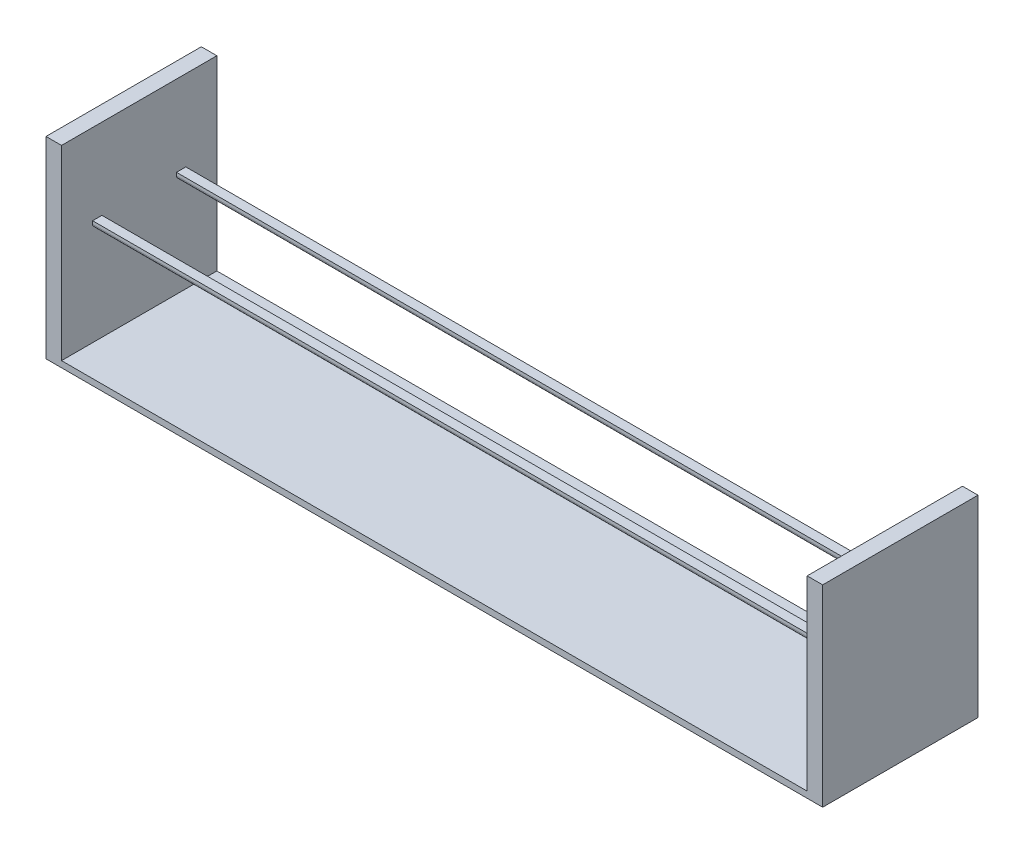
ISO-10303-21;
HEADER;
FILE_DESCRIPTION(('STEP AP214'),'2;1');
FILE_NAME('part.step','',(''),(''),'','','');
FILE_SCHEMA(('AUTOMOTIVE_DESIGN { 1 0 10303 214 1 1 1 1 }'));
ENDSEC;
DATA;
#1=APPLICATION_CONTEXT('core data for automotive mechanical design processes');
#2=APPLICATION_PROTOCOL_DEFINITION('international standard','automotive_design',2000,#1);
#3=PRODUCT_CONTEXT('',#1,'mechanical');
#4=PRODUCT('Part','Part','',(#3));
#5=PRODUCT_RELATED_PRODUCT_CATEGORY('part','',(#4));
#6=PRODUCT_DEFINITION_FORMATION('','',#4);
#7=PRODUCT_DEFINITION_CONTEXT('part definition',#1,'design');
#8=PRODUCT_DEFINITION('design','',#6,#7);
#9=PRODUCT_DEFINITION_SHAPE('','',#8);
#10=(LENGTH_UNIT() NAMED_UNIT(*) SI_UNIT(.MILLI.,.METRE.));
#11=(NAMED_UNIT(*) PLANE_ANGLE_UNIT() SI_UNIT($,.RADIAN.));
#12=(NAMED_UNIT(*) SI_UNIT($,.STERADIAN.) SOLID_ANGLE_UNIT());
#13=UNCERTAINTY_MEASURE_WITH_UNIT(LENGTH_MEASURE(1.E-05),#10,'distance_accuracy_value','');
#14=(GEOMETRIC_REPRESENTATION_CONTEXT(3) GLOBAL_UNCERTAINTY_ASSIGNED_CONTEXT((#13)) GLOBAL_UNIT_ASSIGNED_CONTEXT((#10,
#11,#12)) REPRESENTATION_CONTEXT('',''));
#15=CARTESIAN_POINT('',(0.,0.,0.));
#16=DIRECTION('',(0.,0.,1.));
#17=DIRECTION('',(1.,0.,0.));
#18=AXIS2_PLACEMENT_3D('',#15,#16,#17);
#19=CARTESIAN_POINT('',(-53.4366771151389,310.,-22.1468264795686));
#20=DIRECTION('',(-1.,0.,0.));
#21=DIRECTION('',(0.,0.,1.));
#22=AXIS2_PLACEMENT_3D('',#19,#20,#21);
#23=PLANE('',#22);
#24=DIRECTION('',(0.,0.,1.));
#25=VECTOR('',#24,1.);
#26=CARTESIAN_POINT('',(-53.4366771151389,180.,27.8531735204314));
#27=LINE('',#26,#25);
#28=CARTESIAN_POINT('',(-53.4366771151389,180.,27.8531735204314));
#29=VERTEX_POINT('',#28);
#30=CARTESIAN_POINT('',(-53.4366771151389,180.,42.8531735204314));
#31=VERTEX_POINT('',#30);
#32=EDGE_CURVE('E192',#29,#31,#27,.T.);
#33=ORIENTED_EDGE('',*,*,#32,.F.);
#34=DIRECTION('',(0.,1.,0.));
#35=VECTOR('',#34,1.);
#36=CARTESIAN_POINT('',(-53.4366771151389,180.,27.8531735204314));
#37=LINE('',#36,#35);
#38=CARTESIAN_POINT('',(-53.4366771151389,175.,27.8531735204314));
#39=VERTEX_POINT('',#38);
#40=EDGE_CURVE('E235',#39,#29,#37,.T.);
#41=ORIENTED_EDGE('',*,*,#40,.F.);
#42=CARTESIAN_POINT('',(-53.4366771151389,175.,32.8531735204314));
#43=DIRECTION('',(-1.,0.,0.));
#44=DIRECTION('',(0.,0.,1.));
#45=AXIS2_PLACEMENT_3D('',#42,#43,#44);
#46=CIRCLE('',#45,5.);
#47=CARTESIAN_POINT('',(-53.4366771151389,170.,32.8531735204314));
#48=VERTEX_POINT('',#47);
#49=EDGE_CURVE('E390',#39,#48,#46,.T.);
#50=ORIENTED_EDGE('',*,*,#49,.T.);
#51=DIRECTION('',(0.,0.,-1.));
#52=VECTOR('',#51,1.);
#53=CARTESIAN_POINT('',(-53.4366771151389,170.,27.8531735204314));
#54=LINE('',#53,#52);
#55=CARTESIAN_POINT('',(-53.4366771151389,170.,37.8531735204314));
#56=VERTEX_POINT('',#55);
#57=EDGE_CURVE('E252',#56,#48,#54,.T.);
#58=ORIENTED_EDGE('',*,*,#57,.F.);
#59=CARTESIAN_POINT('',(-53.4366771151389,175.,37.8531735204314));
#60=DIRECTION('',(-1.,0.,0.));
#61=DIRECTION('',(0.,0.,1.));
#62=AXIS2_PLACEMENT_3D('',#59,#60,#61);
#63=CIRCLE('',#62,5.);
#64=CARTESIAN_POINT('',(-53.4366771151389,175.,42.8531735204314));
#65=VERTEX_POINT('',#64);
#66=EDGE_CURVE('E53',#56,#65,#63,.T.);
#67=ORIENTED_EDGE('',*,*,#66,.T.);
#68=DIRECTION('',(0.,-1.,0.));
#69=VECTOR('',#68,1.);
#70=CARTESIAN_POINT('',(-53.4366771151389,180.,42.8531735204314));
#71=LINE('',#70,#69);
#72=EDGE_CURVE('E249',#31,#65,#71,.T.);
#73=ORIENTED_EDGE('',*,*,#72,.F.);
#74=EDGE_LOOP('',(#33,#41,#50,#58,#67,#73));
#75=FACE_BOUND('',#74,.T.);
#76=DIRECTION('',(0.,0.,-1.));
#77=VECTOR('',#76,1.);
#78=CARTESIAN_POINT('',(-53.4366771151389,10.,-22.1468264795686));
#79=LINE('',#78,#77);
#80=CARTESIAN_POINT('',(-53.4366771151389,10.,227.853173520431));
#81=VERTEX_POINT('',#80);
#82=CARTESIAN_POINT('',(-53.4366771151389,10.,-22.1468264795686));
#83=VERTEX_POINT('',#82);
#84=EDGE_CURVE('E278',#81,#83,#79,.T.);
#85=ORIENTED_EDGE('',*,*,#84,.T.);
#86=DIRECTION('',(0.,-1.,0.));
#87=VECTOR('',#86,1.);
#88=CARTESIAN_POINT('',(-53.4366771151389,310.,-22.1468264795686));
#89=LINE('',#88,#87);
#90=CARTESIAN_POINT('',(-53.4366771151389,310.,-22.1468264795686));
#91=VERTEX_POINT('',#90);
#92=EDGE_CURVE('E306',#91,#83,#89,.T.);
#93=ORIENTED_EDGE('',*,*,#92,.F.);
#94=DIRECTION('',(0.,0.,-1.));
#95=VECTOR('',#94,1.);
#96=CARTESIAN_POINT('',(-53.4366771151389,310.,-22.1468264795686));
#97=LINE('',#96,#95);
#98=CARTESIAN_POINT('',(-53.4366771151389,310.,227.853173520431));
#99=VERTEX_POINT('',#98);
#100=EDGE_CURVE('E299',#99,#91,#97,.T.);
#101=ORIENTED_EDGE('',*,*,#100,.F.);
#102=DIRECTION('',(0.,-1.,0.));
#103=VECTOR('',#102,1.);
#104=CARTESIAN_POINT('',(-53.4366771151389,310.,227.853173520431));
#105=LINE('',#104,#103);
#106=EDGE_CURVE('E313',#99,#81,#105,.T.);
#107=ORIENTED_EDGE('',*,*,#106,.T.);
#108=EDGE_LOOP('',(#85,#93,#101,#107));
#109=FACE_BOUND('',#108,.T.);
#110=DIRECTION('',(0.,-1.,0.));
#111=VECTOR('',#110,1.);
#112=CARTESIAN_POINT('',(-53.4366771151389,180.,177.853173520431));
#113=LINE('',#112,#111);
#114=CARTESIAN_POINT('',(-53.4366771151389,180.,177.853173520431));
#115=VERTEX_POINT('',#114);
#116=CARTESIAN_POINT('',(-53.4366771151389,175.,177.853173520431));
#117=VERTEX_POINT('',#116);
#118=EDGE_CURVE('E181',#115,#117,#113,.T.);
#119=ORIENTED_EDGE('',*,*,#118,.F.);
#120=DIRECTION('',(0.,0.,1.));
#121=VECTOR('',#120,1.);
#122=CARTESIAN_POINT('',(-53.4366771151389,180.,177.853173520431));
#123=LINE('',#122,#121);
#124=CARTESIAN_POINT('',(-53.4366771151389,180.,162.853173520431));
#125=VERTEX_POINT('',#124);
#126=EDGE_CURVE('E184',#125,#115,#123,.T.);
#127=ORIENTED_EDGE('',*,*,#126,.F.);
#128=DIRECTION('',(0.,1.,0.));
#129=VECTOR('',#128,1.);
#130=CARTESIAN_POINT('',(-53.4366771151389,180.,162.853173520431));
#131=LINE('',#130,#129);
#132=CARTESIAN_POINT('',(-53.4366771151389,175.,162.853173520431));
#133=VERTEX_POINT('',#132);
#134=EDGE_CURVE('E204',#133,#125,#131,.T.);
#135=ORIENTED_EDGE('',*,*,#134,.F.);
#136=CARTESIAN_POINT('',(-53.4366771151389,175.,167.853173520431));
#137=DIRECTION('',(-1.,0.,0.));
#138=DIRECTION('',(0.,0.,1.));
#139=AXIS2_PLACEMENT_3D('',#136,#137,#138);
#140=CIRCLE('',#139,5.);
#141=CARTESIAN_POINT('',(-53.4366771151389,170.,167.853173520431));
#142=VERTEX_POINT('',#141);
#143=EDGE_CURVE('E366',#133,#142,#140,.T.);
#144=ORIENTED_EDGE('',*,*,#143,.T.);
#145=DIRECTION('',(0.,0.,-1.));
#146=VECTOR('',#145,1.);
#147=CARTESIAN_POINT('',(-53.4366771151389,170.,177.853173520431));
#148=LINE('',#147,#146);
#149=CARTESIAN_POINT('',(-53.4366771151389,170.,172.853173520431));
#150=VERTEX_POINT('',#149);
#151=EDGE_CURVE('E193',#150,#142,#148,.T.);
#152=ORIENTED_EDGE('',*,*,#151,.F.);
#153=CARTESIAN_POINT('',(-53.4366771151389,175.,172.853173520431));
#154=DIRECTION('',(-1.,0.,0.));
#155=DIRECTION('',(0.,0.,1.));
#156=AXIS2_PLACEMENT_3D('',#153,#154,#155);
#157=CIRCLE('',#156,5.);
#158=EDGE_CURVE('E187',#150,#117,#157,.T.);
#159=ORIENTED_EDGE('',*,*,#158,.T.);
#160=EDGE_LOOP('',(#119,#127,#135,#144,#152,#159));
#161=FACE_BOUND('',#160,.T.);
#162=ADVANCED_FACE('F44',(#75,#109,#161),#23,.F.);
#163=CARTESIAN_POINT('',(1146.56332288486,310.,-22.1468264795686));
#164=DIRECTION('',(1.,0.,0.));
#165=DIRECTION('',(0.,0.,-1.));
#166=AXIS2_PLACEMENT_3D('',#163,#164,#165);
#167=PLANE('',#166);
#168=DIRECTION('',(0.,0.,1.));
#169=VECTOR('',#168,1.);
#170=CARTESIAN_POINT('',(1146.56332288486,180.,27.8531735204312));
#171=LINE('',#170,#169);
#172=CARTESIAN_POINT('',(1146.56332288486,180.,27.8531735204312));
#173=VERTEX_POINT('',#172);
#174=CARTESIAN_POINT('',(1146.56332288486,180.,42.8531735204312));
#175=VERTEX_POINT('',#174);
#176=EDGE_CURVE('E231',#173,#175,#171,.T.);
#177=ORIENTED_EDGE('',*,*,#176,.T.);
#178=DIRECTION('',(0.,-1.,0.));
#179=VECTOR('',#178,1.);
#180=CARTESIAN_POINT('',(1146.56332288486,180.,42.8531735204312));
#181=LINE('',#180,#179);
#182=CARTESIAN_POINT('',(1146.56332288486,175.,42.8531735204312));
#183=VERTEX_POINT('',#182);
#184=EDGE_CURVE('E234',#175,#183,#181,.T.);
#185=ORIENTED_EDGE('',*,*,#184,.T.);
#186=CARTESIAN_POINT('',(1146.56332288486,175.,37.8531735204312));
#187=DIRECTION('',(1.,0.,0.));
#188=DIRECTION('',(0.,0.,-1.));
#189=AXIS2_PLACEMENT_3D('',#186,#187,#188);
#190=CIRCLE('',#189,5.);
#191=CARTESIAN_POINT('',(1146.56332288486,170.,37.8531735204312));
#192=VERTEX_POINT('',#191);
#193=EDGE_CURVE('E11',#183,#192,#190,.T.);
#194=ORIENTED_EDGE('',*,*,#193,.T.);
#195=DIRECTION('',(0.,0.,-1.));
#196=VECTOR('',#195,1.);
#197=CARTESIAN_POINT('',(1146.56332288486,170.,27.8531735204312));
#198=LINE('',#197,#196);
#199=CARTESIAN_POINT('',(1146.56332288486,170.,32.8531735204312));
#200=VERTEX_POINT('',#199);
#201=EDGE_CURVE('E238',#192,#200,#198,.T.);
#202=ORIENTED_EDGE('',*,*,#201,.T.);
#203=CARTESIAN_POINT('',(1146.56332288486,175.,32.8531735204312));
#204=DIRECTION('',(1.,0.,0.));
#205=DIRECTION('',(0.,0.,-1.));
#206=AXIS2_PLACEMENT_3D('',#203,#204,#205);
#207=CIRCLE('',#206,5.);
#208=CARTESIAN_POINT('',(1146.56332288486,175.,27.8531735204312));
#209=VERTEX_POINT('',#208);
#210=EDGE_CURVE('E393',#200,#209,#207,.T.);
#211=ORIENTED_EDGE('',*,*,#210,.T.);
#212=DIRECTION('',(0.,1.,0.));
#213=VECTOR('',#212,1.);
#214=CARTESIAN_POINT('',(1146.56332288486,180.,27.8531735204312));
#215=LINE('',#214,#213);
#216=EDGE_CURVE('E242',#209,#173,#215,.T.);
#217=ORIENTED_EDGE('',*,*,#216,.T.);
#218=EDGE_LOOP('',(#177,#185,#194,#202,#211,#217));
#219=FACE_BOUND('',#218,.T.);
#220=DIRECTION('',(0.,0.,1.));
#221=VECTOR('',#220,1.);
#222=CARTESIAN_POINT('',(1146.56332288486,10.,-22.1468264795686));
#223=LINE('',#222,#221);
#224=CARTESIAN_POINT('',(1146.56332288486,10.,-22.1468264795686));
#225=VERTEX_POINT('',#224);
#226=CARTESIAN_POINT('',(1146.56332288486,10.,227.853173520431));
#227=VERTEX_POINT('',#226);
#228=EDGE_CURVE('E274',#225,#227,#223,.T.);
#229=ORIENTED_EDGE('',*,*,#228,.T.);
#230=DIRECTION('',(0.,-1.,0.));
#231=VECTOR('',#230,1.);
#232=CARTESIAN_POINT('',(1146.56332288486,310.,227.853173520431));
#233=LINE('',#232,#231);
#234=CARTESIAN_POINT('',(1146.56332288486,310.,227.853173520431));
#235=VERTEX_POINT('',#234);
#236=EDGE_CURVE('E269',#235,#227,#233,.T.);
#237=ORIENTED_EDGE('',*,*,#236,.F.);
#238=DIRECTION('',(0.,0.,1.));
#239=VECTOR('',#238,1.);
#240=CARTESIAN_POINT('',(1146.56332288486,310.,-22.1468264795686));
#241=LINE('',#240,#239);
#242=CARTESIAN_POINT('',(1146.56332288486,310.,-22.1468264795686));
#243=VERTEX_POINT('',#242);
#244=EDGE_CURVE('E283',#243,#235,#241,.T.);
#245=ORIENTED_EDGE('',*,*,#244,.F.);
#246=DIRECTION('',(0.,-1.,0.));
#247=VECTOR('',#246,1.);
#248=CARTESIAN_POINT('',(1146.56332288486,310.,-22.1468264795686));
#249=LINE('',#248,#247);
#250=EDGE_CURVE('E265',#243,#225,#249,.T.);
#251=ORIENTED_EDGE('',*,*,#250,.T.);
#252=EDGE_LOOP('',(#229,#237,#245,#251));
#253=FACE_BOUND('',#252,.T.);
#254=DIRECTION('',(0.,-1.,0.));
#255=VECTOR('',#254,1.);
#256=CARTESIAN_POINT('',(1146.56332288486,180.,177.853173520431));
#257=LINE('',#256,#255);
#258=CARTESIAN_POINT('',(1146.56332288486,180.,177.853173520431));
#259=VERTEX_POINT('',#258);
#260=CARTESIAN_POINT('',(1146.56332288486,175.,177.853173520431));
#261=VERTEX_POINT('',#260);
#262=EDGE_CURVE('E205',#259,#261,#257,.T.);
#263=ORIENTED_EDGE('',*,*,#262,.T.);
#264=CARTESIAN_POINT('',(1146.56332288486,175.,172.853173520431));
#265=DIRECTION('',(1.,0.,0.));
#266=DIRECTION('',(0.,0.,-1.));
#267=AXIS2_PLACEMENT_3D('',#264,#265,#266);
#268=CIRCLE('',#267,5.);
#269=CARTESIAN_POINT('',(1146.56332288486,170.,172.853173520431));
#270=VERTEX_POINT('',#269);
#271=EDGE_CURVE('E374',#261,#270,#268,.T.);
#272=ORIENTED_EDGE('',*,*,#271,.T.);
#273=DIRECTION('',(0.,0.,-1.));
#274=VECTOR('',#273,1.);
#275=CARTESIAN_POINT('',(1146.56332288486,170.,177.853173520431));
#276=LINE('',#275,#274);
#277=CARTESIAN_POINT('',(1146.56332288486,170.,167.853173520431));
#278=VERTEX_POINT('',#277);
#279=EDGE_CURVE('E225',#270,#278,#276,.T.);
#280=ORIENTED_EDGE('',*,*,#279,.T.);
#281=CARTESIAN_POINT('',(1146.56332288486,175.,167.853173520431));
#282=DIRECTION('',(1.,0.,0.));
#283=DIRECTION('',(0.,0.,-1.));
#284=AXIS2_PLACEMENT_3D('',#281,#282,#283);
#285=CIRCLE('',#284,5.);
#286=CARTESIAN_POINT('',(1146.56332288486,175.,162.853173520431));
#287=VERTEX_POINT('',#286);
#288=EDGE_CURVE('E369',#278,#287,#285,.T.);
#289=ORIENTED_EDGE('',*,*,#288,.T.);
#290=DIRECTION('',(0.,1.,0.));
#291=VECTOR('',#290,1.);
#292=CARTESIAN_POINT('',(1146.56332288486,180.,162.853173520431));
#293=LINE('',#292,#291);
#294=CARTESIAN_POINT('',(1146.56332288486,180.,162.853173520431));
#295=VERTEX_POINT('',#294);
#296=EDGE_CURVE('E214',#287,#295,#293,.T.);
#297=ORIENTED_EDGE('',*,*,#296,.T.);
#298=DIRECTION('',(0.,0.,1.));
#299=VECTOR('',#298,1.);
#300=CARTESIAN_POINT('',(1146.56332288486,180.,177.853173520431));
#301=LINE('',#300,#299);
#302=EDGE_CURVE('E210',#295,#259,#301,.T.);
#303=ORIENTED_EDGE('',*,*,#302,.T.);
#304=EDGE_LOOP('',(#263,#272,#280,#289,#297,#303));
#305=FACE_BOUND('',#304,.T.);
#306=ADVANCED_FACE('F399',(#219,#253,#305),#167,.F.);
#307=CARTESIAN_POINT('',(0.,10.,0.));
#308=DIRECTION('',(0.,1.,0.));
#309=DIRECTION('',(0.,0.,1.));
#310=AXIS2_PLACEMENT_3D('',#307,#308,#309);
#311=PLANE('',#310);
#312=DIRECTION('',(1.,0.,0.));
#313=VECTOR('',#312,1.);
#314=CARTESIAN_POINT('',(-78.4366771151389,10.,227.853173520431));
#315=LINE('',#314,#313);
#316=EDGE_CURVE('E321',#81,#227,#315,.T.);
#317=ORIENTED_EDGE('',*,*,#316,.T.);
#318=ORIENTED_EDGE('',*,*,#228,.F.);
#319=DIRECTION('',(-1.,0.,0.));
#320=VECTOR('',#319,1.);
#321=CARTESIAN_POINT('',(-78.4366771151389,10.,-22.1468264795686));
#322=LINE('',#321,#320);
#323=EDGE_CURVE('E318',#225,#83,#322,.T.);
#324=ORIENTED_EDGE('',*,*,#323,.T.);
#325=ORIENTED_EDGE('',*,*,#84,.F.);
#326=EDGE_LOOP('',(#317,#318,#324,#325));
#327=FACE_BOUND('',#326,.T.);
#328=ADVANCED_FACE('F439',(#327),#311,.T.);
#329=CARTESIAN_POINT('',(1171.56332288486,10.,-22.1468264795686));
#330=DIRECTION('',(-1.,0.,0.));
#331=DIRECTION('',(0.,0.,1.));
#332=AXIS2_PLACEMENT_3D('',#329,#330,#331);
#333=PLANE('',#332);
#334=DIRECTION('',(0.,0.,-1.));
#335=VECTOR('',#334,1.);
#336=CARTESIAN_POINT('',(1171.56332288486,0.,-22.1468264795686));
#337=LINE('',#336,#335);
#338=CARTESIAN_POINT('',(1171.56332288486,0.,227.853173520431));
#339=VERTEX_POINT('',#338);
#340=CARTESIAN_POINT('',(1171.56332288486,0.,-22.1468264795686));
#341=VERTEX_POINT('',#340);
#342=EDGE_CURVE('E317',#339,#341,#337,.T.);
#343=ORIENTED_EDGE('',*,*,#342,.T.);
#344=DIRECTION('',(0.,-1.,0.));
#345=VECTOR('',#344,1.);
#346=CARTESIAN_POINT('',(1171.56332288486,10.,-22.1468264795686));
#347=LINE('',#346,#345);
#348=CARTESIAN_POINT('',(1171.56332288486,310.,-22.1468264795686));
#349=VERTEX_POINT('',#348);
#350=EDGE_CURVE('E348',#349,#341,#347,.T.);
#351=ORIENTED_EDGE('',*,*,#350,.F.);
#352=DIRECTION('',(0.,0.,-1.));
#353=VECTOR('',#352,1.);
#354=CARTESIAN_POINT('',(1171.56332288486,310.,-22.1468264795686));
#355=LINE('',#354,#353);
#356=CARTESIAN_POINT('',(1171.56332288486,310.,227.853173520431));
#357=VERTEX_POINT('',#356);
#358=EDGE_CURVE('E279',#357,#349,#355,.T.);
#359=ORIENTED_EDGE('',*,*,#358,.F.);
#360=DIRECTION('',(0.,-1.,0.));
#361=VECTOR('',#360,1.);
#362=CARTESIAN_POINT('',(1171.56332288486,10.,227.853173520431));
#363=LINE('',#362,#361);
#364=EDGE_CURVE('E325',#357,#339,#363,.T.);
#365=ORIENTED_EDGE('',*,*,#364,.T.);
#366=EDGE_LOOP('',(#343,#351,#359,#365));
#367=FACE_BOUND('',#366,.T.);
#368=ADVANCED_FACE('F444',(#367),#333,.F.);
#369=CARTESIAN_POINT('',(-78.4366771151389,10.,-22.1468264795686));
#370=DIRECTION('',(0.,0.,1.));
#371=DIRECTION('',(1.,0.,0.));
#372=AXIS2_PLACEMENT_3D('',#369,#370,#371);
#373=PLANE('',#372);
#374=DIRECTION('',(-1.,0.,0.));
#375=VECTOR('',#374,1.);
#376=CARTESIAN_POINT('',(-78.4366771151389,0.,-22.1468264795686));
#377=LINE('',#376,#375);
#378=CARTESIAN_POINT('',(-78.4366771151389,0.,-22.1468264795686));
#379=VERTEX_POINT('',#378);
#380=EDGE_CURVE('E329',#341,#379,#377,.T.);
#381=ORIENTED_EDGE('',*,*,#380,.T.);
#382=DIRECTION('',(0.,-1.,0.));
#383=VECTOR('',#382,1.);
#384=CARTESIAN_POINT('',(-78.4366771151389,10.,-22.1468264795686));
#385=LINE('',#384,#383);
#386=CARTESIAN_POINT('',(-78.4366771151389,310.,-22.1468264795686));
#387=VERTEX_POINT('',#386);
#388=EDGE_CURVE('E344',#387,#379,#385,.T.);
#389=ORIENTED_EDGE('',*,*,#388,.F.);
#390=DIRECTION('',(-1.,0.,0.));
#391=VECTOR('',#390,1.);
#392=CARTESIAN_POINT('',(-78.4366771151389,310.,-22.1468264795686));
#393=LINE('',#392,#391);
#394=EDGE_CURVE('E302',#91,#387,#393,.T.);
#395=ORIENTED_EDGE('',*,*,#394,.F.);
#396=ORIENTED_EDGE('',*,*,#92,.T.);
#397=ORIENTED_EDGE('',*,*,#323,.F.);
#398=ORIENTED_EDGE('',*,*,#250,.F.);
#399=DIRECTION('',(-1.,0.,0.));
#400=VECTOR('',#399,1.);
#401=CARTESIAN_POINT('',(1171.56332288486,310.,-22.1468264795686));
#402=LINE('',#401,#400);
#403=EDGE_CURVE('E286',#349,#243,#402,.T.);
#404=ORIENTED_EDGE('',*,*,#403,.F.);
#405=ORIENTED_EDGE('',*,*,#350,.T.);
#406=EDGE_LOOP('',(#381,#389,#395,#396,#397,#398,#404,#405));
#407=FACE_BOUND('',#406,.T.);
#408=ADVANCED_FACE('F457',(#407),#373,.F.);
#409=CARTESIAN_POINT('',(-78.4366771151389,10.,-22.1468264795686));
#410=DIRECTION('',(1.,0.,0.));
#411=DIRECTION('',(0.,0.,-1.));
#412=AXIS2_PLACEMENT_3D('',#409,#410,#411);
#413=PLANE('',#412);
#414=DIRECTION('',(0.,0.,1.));
#415=VECTOR('',#414,1.);
#416=CARTESIAN_POINT('',(-78.4366771151389,0.,-22.1468264795686));
#417=LINE('',#416,#415);
#418=CARTESIAN_POINT('',(-78.4366771151389,0.,227.853173520431));
#419=VERTEX_POINT('',#418);
#420=EDGE_CURVE('E332',#379,#419,#417,.T.);
#421=ORIENTED_EDGE('',*,*,#420,.T.);
#422=DIRECTION('',(0.,-1.,0.));
#423=VECTOR('',#422,1.);
#424=CARTESIAN_POINT('',(-78.4366771151389,10.,227.853173520431));
#425=LINE('',#424,#423);
#426=CARTESIAN_POINT('',(-78.4366771151389,310.,227.853173520431));
#427=VERTEX_POINT('',#426);
#428=EDGE_CURVE('E340',#427,#419,#425,.T.);
#429=ORIENTED_EDGE('',*,*,#428,.F.);
#430=DIRECTION('',(0.,0.,1.));
#431=VECTOR('',#430,1.);
#432=CARTESIAN_POINT('',(-78.4366771151389,310.,-22.1468264795686));
#433=LINE('',#432,#431);
#434=EDGE_CURVE('E292',#387,#427,#433,.T.);
#435=ORIENTED_EDGE('',*,*,#434,.F.);
#436=ORIENTED_EDGE('',*,*,#388,.T.);
#437=EDGE_LOOP('',(#421,#429,#435,#436));
#438=FACE_BOUND('',#437,.T.);
#439=ADVANCED_FACE('F453',(#438),#413,.F.);
#440=CARTESIAN_POINT('',(-78.4366771151389,10.,227.853173520431));
#441=DIRECTION('',(0.,0.,-1.));
#442=DIRECTION('',(-1.,0.,0.));
#443=AXIS2_PLACEMENT_3D('',#440,#441,#442);
#444=PLANE('',#443);
#445=DIRECTION('',(1.,0.,0.));
#446=VECTOR('',#445,1.);
#447=CARTESIAN_POINT('',(-78.4366771151389,0.,227.853173520431));
#448=LINE('',#447,#446);
#449=EDGE_CURVE('E322',#419,#339,#448,.T.);
#450=ORIENTED_EDGE('',*,*,#449,.T.);
#451=ORIENTED_EDGE('',*,*,#364,.F.);
#452=DIRECTION('',(1.,0.,0.));
#453=VECTOR('',#452,1.);
#454=CARTESIAN_POINT('',(1171.56332288486,310.,227.853173520431));
#455=LINE('',#454,#453);
#456=EDGE_CURVE('E273',#235,#357,#455,.T.);
#457=ORIENTED_EDGE('',*,*,#456,.F.);
#458=ORIENTED_EDGE('',*,*,#236,.T.);
#459=ORIENTED_EDGE('',*,*,#316,.F.);
#460=ORIENTED_EDGE('',*,*,#106,.F.);
#461=DIRECTION('',(1.,0.,0.));
#462=VECTOR('',#461,1.);
#463=CARTESIAN_POINT('',(-78.4366771151389,310.,227.853173520431));
#464=LINE('',#463,#462);
#465=EDGE_CURVE('E296',#427,#99,#464,.T.);
#466=ORIENTED_EDGE('',*,*,#465,.F.);
#467=ORIENTED_EDGE('',*,*,#428,.T.);
#468=EDGE_LOOP('',(#450,#451,#457,#458,#459,#460,#466,#467));
#469=FACE_BOUND('',#468,.T.);
#470=ADVANCED_FACE('F449',(#469),#444,.F.);
#471=CARTESIAN_POINT('',(0.,0.,0.));
#472=DIRECTION('',(0.,1.,0.));
#473=DIRECTION('',(0.,0.,1.));
#474=AXIS2_PLACEMENT_3D('',#471,#472,#473);
#475=PLANE('',#474);
#476=ORIENTED_EDGE('',*,*,#342,.F.);
#477=ORIENTED_EDGE('',*,*,#449,.F.);
#478=ORIENTED_EDGE('',*,*,#420,.F.);
#479=ORIENTED_EDGE('',*,*,#380,.F.);
#480=EDGE_LOOP('',(#476,#477,#478,#479));
#481=FACE_BOUND('',#480,.T.);
#482=ADVANCED_FACE('F446',(#481),#475,.F.);
#483=CARTESIAN_POINT('',(0.,310.,0.));
#484=DIRECTION('',(0.,1.,0.));
#485=DIRECTION('',(0.,0.,1.));
#486=AXIS2_PLACEMENT_3D('',#483,#484,#485);
#487=PLANE('',#486);
#488=ORIENTED_EDGE('',*,*,#434,.T.);
#489=ORIENTED_EDGE('',*,*,#465,.T.);
#490=ORIENTED_EDGE('',*,*,#100,.T.);
#491=ORIENTED_EDGE('',*,*,#394,.T.);
#492=EDGE_LOOP('',(#488,#489,#490,#491));
#493=FACE_BOUND('',#492,.T.);
#494=ADVANCED_FACE('F430',(#493),#487,.T.);
#495=CARTESIAN_POINT('',(0.,310.,0.));
#496=DIRECTION('',(0.,-1.,0.));
#497=DIRECTION('',(0.,0.,-1.));
#498=AXIS2_PLACEMENT_3D('',#495,#496,#497);
#499=PLANE('',#498);
#500=ORIENTED_EDGE('',*,*,#358,.T.);
#501=ORIENTED_EDGE('',*,*,#403,.T.);
#502=ORIENTED_EDGE('',*,*,#244,.T.);
#503=ORIENTED_EDGE('',*,*,#456,.T.);
#504=EDGE_LOOP('',(#500,#501,#502,#503));
#505=FACE_BOUND('',#504,.T.);
#506=ADVANCED_FACE('F423',(#505),#499,.F.);
#507=CARTESIAN_POINT('',(1146.56332288486,180.,27.8531735204312));
#508=DIRECTION('',(0.,-1.,0.));
#509=DIRECTION('',(0.,0.,-1.));
#510=AXIS2_PLACEMENT_3D('',#507,#508,#509);
#511=PLANE('',#510);
#512=ORIENTED_EDGE('',*,*,#32,.T.);
#513=DIRECTION('',(-1.,0.,0.));
#514=VECTOR('',#513,1.);
#515=CARTESIAN_POINT('',(1146.56332288486,180.,42.8531735204312));
#516=LINE('',#515,#514);
#517=EDGE_CURVE('E261',#175,#31,#516,.T.);
#518=ORIENTED_EDGE('',*,*,#517,.F.);
#519=ORIENTED_EDGE('',*,*,#176,.F.);
#520=DIRECTION('',(-1.,0.,0.));
#521=VECTOR('',#520,1.);
#522=CARTESIAN_POINT('',(1146.56332288486,180.,27.8531735204312));
#523=LINE('',#522,#521);
#524=EDGE_CURVE('E245',#173,#29,#523,.T.);
#525=ORIENTED_EDGE('',*,*,#524,.T.);
#526=EDGE_LOOP('',(#512,#518,#519,#525));
#527=FACE_BOUND('',#526,.T.);
#528=ADVANCED_FACE('F421',(#527),#511,.F.);
#529=CARTESIAN_POINT('',(1146.56332288486,180.,42.8531735204312));
#530=DIRECTION('',(0.,0.,-1.));
#531=DIRECTION('',(-1.,0.,0.));
#532=AXIS2_PLACEMENT_3D('',#529,#530,#531);
#533=PLANE('',#532);
#534=ORIENTED_EDGE('',*,*,#72,.T.);
#535=DIRECTION('',(-1.,0.,0.));
#536=VECTOR('',#535,1.);
#537=CARTESIAN_POINT('',(1146.56332288486,175.,42.8531735204312));
#538=LINE('',#537,#536);
#539=EDGE_CURVE('E60',#65,#183,#538,.F.);
#540=ORIENTED_EDGE('',*,*,#539,.T.);
#541=ORIENTED_EDGE('',*,*,#184,.F.);
#542=ORIENTED_EDGE('',*,*,#517,.T.);
#543=EDGE_LOOP('',(#534,#540,#541,#542));
#544=FACE_BOUND('',#543,.T.);
#545=ADVANCED_FACE('F419',(#544),#533,.F.);
#546=CARTESIAN_POINT('',(1146.56332288486,170.,27.8531735204312));
#547=DIRECTION('',(0.,1.,0.));
#548=DIRECTION('',(0.,0.,1.));
#549=AXIS2_PLACEMENT_3D('',#546,#547,#548);
#550=PLANE('',#549);
#551=ORIENTED_EDGE('',*,*,#57,.T.);
#552=DIRECTION('',(-1.,0.,0.));
#553=VECTOR('',#552,1.);
#554=CARTESIAN_POINT('',(1146.56332288486,170.,32.8531735204312));
#555=LINE('',#554,#553);
#556=EDGE_CURVE('E385',#48,#200,#555,.F.);
#557=ORIENTED_EDGE('',*,*,#556,.T.);
#558=ORIENTED_EDGE('',*,*,#201,.F.);
#559=DIRECTION('',(-1.,0.,0.));
#560=VECTOR('',#559,1.);
#561=CARTESIAN_POINT('',(1146.56332288486,170.,37.8531735204312));
#562=LINE('',#561,#560);
#563=EDGE_CURVE('E381',#192,#56,#562,.T.);
#564=ORIENTED_EDGE('',*,*,#563,.T.);
#565=EDGE_LOOP('',(#551,#557,#558,#564));
#566=FACE_BOUND('',#565,.T.);
#567=ADVANCED_FACE('F414',(#566),#550,.F.);
#568=CARTESIAN_POINT('',(1146.56332288486,180.,27.8531735204312));
#569=DIRECTION('',(0.,0.,1.));
#570=DIRECTION('',(1.,0.,0.));
#571=AXIS2_PLACEMENT_3D('',#568,#569,#570);
#572=PLANE('',#571);
#573=ORIENTED_EDGE('',*,*,#216,.F.);
#574=DIRECTION('',(-1.,0.,0.));
#575=VECTOR('',#574,1.);
#576=CARTESIAN_POINT('',(1146.56332288486,175.,27.8531735204312));
#577=LINE('',#576,#575);
#578=EDGE_CURVE('E377',#209,#39,#577,.T.);
#579=ORIENTED_EDGE('',*,*,#578,.T.);
#580=ORIENTED_EDGE('',*,*,#40,.T.);
#581=ORIENTED_EDGE('',*,*,#524,.F.);
#582=EDGE_LOOP('',(#573,#579,#580,#581));
#583=FACE_BOUND('',#582,.T.);
#584=ADVANCED_FACE('F407',(#583),#572,.F.);
#585=CARTESIAN_POINT('',(1146.56332288486,180.,177.853173520431));
#586=DIRECTION('',(0.,0.,-1.));
#587=DIRECTION('',(-1.,0.,0.));
#588=AXIS2_PLACEMENT_3D('',#585,#586,#587);
#589=PLANE('',#588);
#590=ORIENTED_EDGE('',*,*,#118,.T.);
#591=DIRECTION('',(-1.,0.,0.));
#592=VECTOR('',#591,1.);
#593=CARTESIAN_POINT('',(1146.56332288486,175.,177.853173520431));
#594=LINE('',#593,#592);
#595=EDGE_CURVE('E363',#117,#261,#594,.F.);
#596=ORIENTED_EDGE('',*,*,#595,.T.);
#597=ORIENTED_EDGE('',*,*,#262,.F.);
#598=DIRECTION('',(-1.,0.,0.));
#599=VECTOR('',#598,1.);
#600=CARTESIAN_POINT('',(1146.56332288486,180.,177.853173520431));
#601=LINE('',#600,#599);
#602=EDGE_CURVE('E199',#259,#115,#601,.T.);
#603=ORIENTED_EDGE('',*,*,#602,.T.);
#604=EDGE_LOOP('',(#590,#596,#597,#603));
#605=FACE_BOUND('',#604,.T.);
#606=ADVANCED_FACE('F207',(#605),#589,.F.);
#607=CARTESIAN_POINT('',(1146.56332288486,170.,177.853173520431));
#608=DIRECTION('',(0.,1.,0.));
#609=DIRECTION('',(0.,0.,1.));
#610=AXIS2_PLACEMENT_3D('',#607,#608,#609);
#611=PLANE('',#610);
#612=ORIENTED_EDGE('',*,*,#151,.T.);
#613=DIRECTION('',(-1.,0.,0.));
#614=VECTOR('',#613,1.);
#615=CARTESIAN_POINT('',(1146.56332288486,170.,167.853173520431));
#616=LINE('',#615,#614);
#617=EDGE_CURVE('E360',#142,#278,#616,.F.);
#618=ORIENTED_EDGE('',*,*,#617,.T.);
#619=ORIENTED_EDGE('',*,*,#279,.F.);
#620=DIRECTION('',(-1.,0.,0.));
#621=VECTOR('',#620,1.);
#622=CARTESIAN_POINT('',(1146.56332288486,170.,172.853173520431));
#623=LINE('',#622,#621);
#624=EDGE_CURVE('E356',#270,#150,#623,.T.);
#625=ORIENTED_EDGE('',*,*,#624,.T.);
#626=EDGE_LOOP('',(#612,#618,#619,#625));
#627=FACE_BOUND('',#626,.T.);
#628=ADVANCED_FACE('F551',(#627),#611,.F.);
#629=CARTESIAN_POINT('',(1146.56332288486,180.,162.853173520431));
#630=DIRECTION('',(0.,0.,1.));
#631=DIRECTION('',(1.,0.,0.));
#632=AXIS2_PLACEMENT_3D('',#629,#630,#631);
#633=PLANE('',#632);
#634=ORIENTED_EDGE('',*,*,#296,.F.);
#635=DIRECTION('',(-1.,0.,0.));
#636=VECTOR('',#635,1.);
#637=CARTESIAN_POINT('',(1146.56332288486,175.,162.853173520431));
#638=LINE('',#637,#636);
#639=EDGE_CURVE('E352',#287,#133,#638,.T.);
#640=ORIENTED_EDGE('',*,*,#639,.T.);
#641=ORIENTED_EDGE('',*,*,#134,.T.);
#642=DIRECTION('',(-1.,0.,0.));
#643=VECTOR('',#642,1.);
#644=CARTESIAN_POINT('',(1146.56332288486,180.,162.853173520431));
#645=LINE('',#644,#643);
#646=EDGE_CURVE('E202',#295,#125,#645,.T.);
#647=ORIENTED_EDGE('',*,*,#646,.F.);
#648=EDGE_LOOP('',(#634,#640,#641,#647));
#649=FACE_BOUND('',#648,.T.);
#650=ADVANCED_FACE('F546',(#649),#633,.F.);
#651=CARTESIAN_POINT('',(1146.56332288486,180.,177.853173520431));
#652=DIRECTION('',(0.,-1.,0.));
#653=DIRECTION('',(0.,0.,-1.));
#654=AXIS2_PLACEMENT_3D('',#651,#652,#653);
#655=PLANE('',#654);
#656=ORIENTED_EDGE('',*,*,#126,.T.);
#657=ORIENTED_EDGE('',*,*,#602,.F.);
#658=ORIENTED_EDGE('',*,*,#302,.F.);
#659=ORIENTED_EDGE('',*,*,#646,.T.);
#660=EDGE_LOOP('',(#656,#657,#658,#659));
#661=FACE_BOUND('',#660,.T.);
#662=ADVANCED_FACE('F197',(#661),#655,.F.);
#663=CARTESIAN_POINT('',(1146.56332288486,175.,167.853173520431));
#664=DIRECTION('',(-1.,0.,0.));
#665=DIRECTION('',(0.,0.,1.));
#666=AXIS2_PLACEMENT_3D('',#663,#664,#665);
#667=CYLINDRICAL_SURFACE('',#666,5.);
#668=ORIENTED_EDGE('',*,*,#288,.F.);
#669=ORIENTED_EDGE('',*,*,#617,.F.);
#670=ORIENTED_EDGE('',*,*,#143,.F.);
#671=ORIENTED_EDGE('',*,*,#639,.F.);
#672=EDGE_LOOP('',(#668,#669,#670,#671));
#673=FACE_BOUND('',#672,.T.);
#674=ADVANCED_FACE('F465',(#673),#667,.T.);
#675=CARTESIAN_POINT('',(1146.56332288486,175.,172.853173520431));
#676=DIRECTION('',(-1.,0.,0.));
#677=DIRECTION('',(0.,0.,1.));
#678=AXIS2_PLACEMENT_3D('',#675,#676,#677);
#679=CYLINDRICAL_SURFACE('',#678,5.);
#680=ORIENTED_EDGE('',*,*,#271,.F.);
#681=ORIENTED_EDGE('',*,*,#595,.F.);
#682=ORIENTED_EDGE('',*,*,#158,.F.);
#683=ORIENTED_EDGE('',*,*,#624,.F.);
#684=EDGE_LOOP('',(#680,#681,#682,#683));
#685=FACE_BOUND('',#684,.T.);
#686=ADVANCED_FACE('F468',(#685),#679,.T.);
#687=CARTESIAN_POINT('',(1146.56332288486,175.,32.8531735204312));
#688=DIRECTION('',(-1.,0.,0.));
#689=DIRECTION('',(0.,0.,1.));
#690=AXIS2_PLACEMENT_3D('',#687,#688,#689);
#691=CYLINDRICAL_SURFACE('',#690,5.);
#692=ORIENTED_EDGE('',*,*,#210,.F.);
#693=ORIENTED_EDGE('',*,*,#556,.F.);
#694=ORIENTED_EDGE('',*,*,#49,.F.);
#695=ORIENTED_EDGE('',*,*,#578,.F.);
#696=EDGE_LOOP('',(#692,#693,#694,#695));
#697=FACE_BOUND('',#696,.T.);
#698=ADVANCED_FACE('F410',(#697),#691,.T.);
#699=CARTESIAN_POINT('',(1146.56332288486,175.,37.8531735204312));
#700=DIRECTION('',(-1.,0.,0.));
#701=DIRECTION('',(0.,0.,1.));
#702=AXIS2_PLACEMENT_3D('',#699,#700,#701);
#703=CYLINDRICAL_SURFACE('',#702,5.);
#704=ORIENTED_EDGE('',*,*,#193,.F.);
#705=ORIENTED_EDGE('',*,*,#539,.F.);
#706=ORIENTED_EDGE('',*,*,#66,.F.);
#707=ORIENTED_EDGE('',*,*,#563,.F.);
#708=EDGE_LOOP('',(#704,#705,#706,#707));
#709=FACE_BOUND('',#708,.T.);
#710=ADVANCED_FACE('F46',(#709),#703,.T.);
#711=CLOSED_SHELL('',(#162,#306,#328,#368,#408,#439,#470,#482,#494,#506,#528,#545,#567,#584,
#606,#628,#650,#662,#674,#686,#698,#710));
#712=MANIFOLD_SOLID_BREP('B2',#711);
#713=ADVANCED_BREP_SHAPE_REPRESENTATION('',(#18,#712),#14);
#714=SHAPE_DEFINITION_REPRESENTATION(#9,#713);
ENDSEC;
END-ISO-10303-21;
